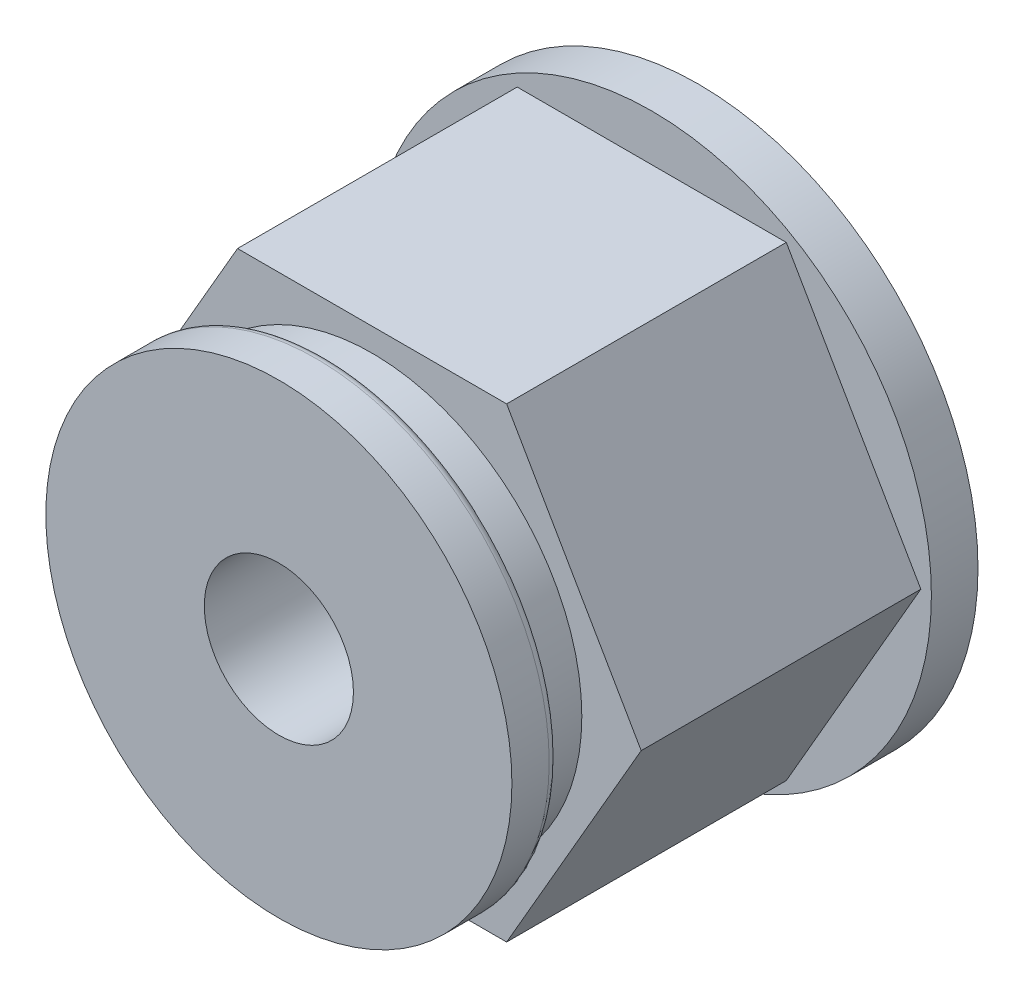
ISO-10303-21;
HEADER;
FILE_DESCRIPTION(('STEP AP214'),'2;1');
FILE_NAME('part.step','',(''),(''),'','','');
FILE_SCHEMA(('AUTOMOTIVE_DESIGN { 1 0 10303 214 1 1 1 1 }'));
ENDSEC;
DATA;
#1=APPLICATION_CONTEXT('core data for automotive mechanical design processes');
#2=APPLICATION_PROTOCOL_DEFINITION('international standard','automotive_design',2000,#1);
#3=PRODUCT_CONTEXT('',#1,'mechanical');
#4=PRODUCT('Part','Part','',(#3));
#5=PRODUCT_RELATED_PRODUCT_CATEGORY('part','',(#4));
#6=PRODUCT_DEFINITION_FORMATION('','',#4);
#7=PRODUCT_DEFINITION_CONTEXT('part definition',#1,'design');
#8=PRODUCT_DEFINITION('design','',#6,#7);
#9=PRODUCT_DEFINITION_SHAPE('','',#8);
#10=(LENGTH_UNIT() NAMED_UNIT(*) SI_UNIT(.MILLI.,.METRE.));
#11=(NAMED_UNIT(*) PLANE_ANGLE_UNIT() SI_UNIT($,.RADIAN.));
#12=(NAMED_UNIT(*) SI_UNIT($,.STERADIAN.) SOLID_ANGLE_UNIT());
#13=UNCERTAINTY_MEASURE_WITH_UNIT(LENGTH_MEASURE(1.E-05),#10,'distance_accuracy_value','');
#14=(GEOMETRIC_REPRESENTATION_CONTEXT(3) GLOBAL_UNCERTAINTY_ASSIGNED_CONTEXT((#13)) GLOBAL_UNIT_ASSIGNED_CONTEXT((#10,
#11,#12)) REPRESENTATION_CONTEXT('',''));
#15=CARTESIAN_POINT('',(0.,0.,0.));
#16=DIRECTION('',(0.,0.,1.));
#17=DIRECTION('',(1.,0.,0.));
#18=AXIS2_PLACEMENT_3D('',#15,#16,#17);
#19=CARTESIAN_POINT('',(0.,0.,1.27));
#20=DIRECTION('',(0.,0.,-1.));
#21=DIRECTION('',(-1.,0.,0.));
#22=AXIS2_PLACEMENT_3D('',#19,#20,#21);
#23=CYLINDRICAL_SURFACE('',#22,7.62);
#24=CARTESIAN_POINT('',(0.,0.,1.27));
#25=DIRECTION('',(0.,0.,1.));
#26=DIRECTION('',(1.,0.,0.));
#27=AXIS2_PLACEMENT_3D('',#24,#25,#26);
#28=CIRCLE('',#27,7.62);
#29=CARTESIAN_POINT('',(7.62,0.,1.27));
#30=VERTEX_POINT('',#29);
#31=EDGE_CURVE('E109',#30,#30,#28,.T.);
#32=ORIENTED_EDGE('',*,*,#31,.F.);
#33=EDGE_LOOP('',(#32));
#34=FACE_BOUND('',#33,.T.);
#35=CARTESIAN_POINT('',(0.,0.,0.));
#36=DIRECTION('',(0.,0.,1.));
#37=DIRECTION('',(1.,0.,0.));
#38=AXIS2_PLACEMENT_3D('',#35,#36,#37);
#39=CIRCLE('',#38,7.62);
#40=CARTESIAN_POINT('',(7.62,0.,0.));
#41=VERTEX_POINT('',#40);
#42=EDGE_CURVE('E106',#41,#41,#39,.T.);
#43=ORIENTED_EDGE('',*,*,#42,.T.);
#44=EDGE_LOOP('',(#43));
#45=FACE_BOUND('',#44,.T.);
#46=ADVANCED_FACE('F33',(#34,#45),#23,.T.);
#47=CARTESIAN_POINT('',(0.,0.,1.27));
#48=DIRECTION('',(0.,0.,1.));
#49=DIRECTION('',(1.,0.,0.));
#50=AXIS2_PLACEMENT_3D('',#47,#48,#49);
#51=PLANE('',#50);
#52=DIRECTION('',(-0.5,0.866025403784439,0.));
#53=VECTOR('',#52,1.);
#54=CARTESIAN_POINT('',(7.33234841870825,0.,1.27));
#55=LINE('',#54,#53);
#56=CARTESIAN_POINT('',(7.33234841870825,0.,1.27));
#57=VERTEX_POINT('',#56);
#58=CARTESIAN_POINT('',(3.66617420935413,6.35,1.27));
#59=VERTEX_POINT('',#58);
#60=EDGE_CURVE('E48',#57,#59,#55,.T.);
#61=ORIENTED_EDGE('',*,*,#60,.F.);
#62=DIRECTION('',(0.500000000000001,0.866025403784438,0.));
#63=VECTOR('',#62,1.);
#64=CARTESIAN_POINT('',(3.66617420935412,-6.35,1.27));
#65=LINE('',#64,#63);
#66=CARTESIAN_POINT('',(3.66617420935412,-6.35,1.27));
#67=VERTEX_POINT('',#66);
#68=EDGE_CURVE('E52',#67,#57,#65,.T.);
#69=ORIENTED_EDGE('',*,*,#68,.F.);
#70=DIRECTION('',(1.,0.,0.));
#71=VECTOR('',#70,1.);
#72=CARTESIAN_POINT('',(-3.66617420935412,-6.35,1.27));
#73=LINE('',#72,#71);
#74=CARTESIAN_POINT('',(-3.66617420935412,-6.35,1.27));
#75=VERTEX_POINT('',#74);
#76=EDGE_CURVE('E169',#75,#67,#73,.T.);
#77=ORIENTED_EDGE('',*,*,#76,.F.);
#78=DIRECTION('',(0.5,-0.866025403784439,0.));
#79=VECTOR('',#78,1.);
#80=CARTESIAN_POINT('',(-7.33234841870825,0.,1.27));
#81=LINE('',#80,#79);
#82=CARTESIAN_POINT('',(-7.33234841870825,0.,1.27));
#83=VERTEX_POINT('',#82);
#84=EDGE_CURVE('E166',#83,#75,#81,.T.);
#85=ORIENTED_EDGE('',*,*,#84,.F.);
#86=DIRECTION('',(-0.500000000000001,-0.866025403784438,0.));
#87=VECTOR('',#86,1.);
#88=CARTESIAN_POINT('',(-3.66617420935412,6.35,1.27));
#89=LINE('',#88,#87);
#90=CARTESIAN_POINT('',(-3.66617420935412,6.35,1.27));
#91=VERTEX_POINT('',#90);
#92=EDGE_CURVE('E163',#91,#83,#89,.T.);
#93=ORIENTED_EDGE('',*,*,#92,.F.);
#94=DIRECTION('',(-1.,0.,0.));
#95=VECTOR('',#94,1.);
#96=CARTESIAN_POINT('',(3.66617420935413,6.35,1.27));
#97=LINE('',#96,#95);
#98=EDGE_CURVE('E146',#59,#91,#97,.T.);
#99=ORIENTED_EDGE('',*,*,#98,.F.);
#100=EDGE_LOOP('',(#61,#69,#77,#85,#93,#99));
#101=FACE_BOUND('',#100,.T.);
#102=ORIENTED_EDGE('',*,*,#31,.T.);
#103=EDGE_LOOP('',(#102));
#104=FACE_BOUND('',#103,.T.);
#105=ADVANCED_FACE('F186',(#101,#104),#51,.T.);
#106=CARTESIAN_POINT('',(0.,0.,0.));
#107=DIRECTION('',(0.,0.,1.));
#108=DIRECTION('',(1.,0.,0.));
#109=AXIS2_PLACEMENT_3D('',#106,#107,#108);
#110=PLANE('',#109);
#111=CARTESIAN_POINT('',(0.,0.,0.));
#112=DIRECTION('',(0.,0.,1.));
#113=DIRECTION('',(1.,0.,0.));
#114=AXIS2_PLACEMENT_3D('',#111,#112,#113);
#115=CIRCLE('',#114,2.032);
#116=CARTESIAN_POINT('',(2.032,0.,0.));
#117=VERTEX_POINT('',#116);
#118=EDGE_CURVE('E144',#117,#117,#115,.F.);
#119=ORIENTED_EDGE('',*,*,#118,.F.);
#120=EDGE_LOOP('',(#119));
#121=FACE_BOUND('',#120,.T.);
#122=ORIENTED_EDGE('',*,*,#42,.F.);
#123=EDGE_LOOP('',(#122));
#124=FACE_BOUND('',#123,.T.);
#125=ADVANCED_FACE('F209',(#121,#124),#110,.F.);
#126=CARTESIAN_POINT('',(7.33234841870825,0.,8.89));
#127=DIRECTION('',(-0.866025403784439,-0.5,0.));
#128=DIRECTION('',(0.5,-0.866025403784439,0.));
#129=AXIS2_PLACEMENT_3D('',#126,#127,#128);
#130=PLANE('',#129);
#131=ORIENTED_EDGE('',*,*,#60,.T.);
#132=DIRECTION('',(0.,0.,-1.));
#133=VECTOR('',#132,1.);
#134=CARTESIAN_POINT('',(3.66617420935413,6.35,8.89));
#135=LINE('',#134,#133);
#136=CARTESIAN_POINT('',(3.66617420935413,6.35,8.89));
#137=VERTEX_POINT('',#136);
#138=EDGE_CURVE('E89',#137,#59,#135,.T.);
#139=ORIENTED_EDGE('',*,*,#138,.F.);
#140=DIRECTION('',(-0.5,0.866025403784439,0.));
#141=VECTOR('',#140,1.);
#142=CARTESIAN_POINT('',(7.33234841870825,0.,8.89));
#143=LINE('',#142,#141);
#144=CARTESIAN_POINT('',(7.33234841870825,0.,8.89));
#145=VERTEX_POINT('',#144);
#146=EDGE_CURVE('E95',#145,#137,#143,.T.);
#147=ORIENTED_EDGE('',*,*,#146,.F.);
#148=DIRECTION('',(0.,0.,-1.));
#149=VECTOR('',#148,1.);
#150=CARTESIAN_POINT('',(7.33234841870825,0.,8.89));
#151=LINE('',#150,#149);
#152=EDGE_CURVE('E160',#145,#57,#151,.T.);
#153=ORIENTED_EDGE('',*,*,#152,.T.);
#154=EDGE_LOOP('',(#131,#139,#147,#153));
#155=FACE_BOUND('',#154,.T.);
#156=ADVANCED_FACE('F105',(#155),#130,.F.);
#157=CARTESIAN_POINT('',(3.66617420935413,6.35,8.89));
#158=DIRECTION('',(0.,-1.,0.));
#159=DIRECTION('',(1.,0.,0.));
#160=AXIS2_PLACEMENT_3D('',#157,#158,#159);
#161=PLANE('',#160);
#162=ORIENTED_EDGE('',*,*,#98,.T.);
#163=DIRECTION('',(0.,0.,-1.));
#164=VECTOR('',#163,1.);
#165=CARTESIAN_POINT('',(-3.66617420935412,6.35,8.89));
#166=LINE('',#165,#164);
#167=CARTESIAN_POINT('',(-3.66617420935412,6.35,8.89));
#168=VERTEX_POINT('',#167);
#169=EDGE_CURVE('E91',#168,#91,#166,.T.);
#170=ORIENTED_EDGE('',*,*,#169,.F.);
#171=DIRECTION('',(-1.,0.,0.));
#172=VECTOR('',#171,1.);
#173=CARTESIAN_POINT('',(3.66617420935413,6.35,8.89));
#174=LINE('',#173,#172);
#175=EDGE_CURVE('E84',#137,#168,#174,.T.);
#176=ORIENTED_EDGE('',*,*,#175,.F.);
#177=ORIENTED_EDGE('',*,*,#138,.T.);
#178=EDGE_LOOP('',(#162,#170,#176,#177));
#179=FACE_BOUND('',#178,.T.);
#180=ADVANCED_FACE('F87',(#179),#161,.F.);
#181=CARTESIAN_POINT('',(-3.66617420935412,6.35,8.89));
#182=DIRECTION('',(0.866025403784438,-0.500000000000001,0.));
#183=DIRECTION('',(0.500000000000001,0.866025403784438,0.));
#184=AXIS2_PLACEMENT_3D('',#181,#182,#183);
#185=PLANE('',#184);
#186=ORIENTED_EDGE('',*,*,#92,.T.);
#187=DIRECTION('',(0.,0.,-1.));
#188=VECTOR('',#187,1.);
#189=CARTESIAN_POINT('',(-7.33234841870825,0.,8.89));
#190=LINE('',#189,#188);
#191=CARTESIAN_POINT('',(-7.33234841870825,0.,8.89));
#192=VERTEX_POINT('',#191);
#193=EDGE_CURVE('E111',#192,#83,#190,.T.);
#194=ORIENTED_EDGE('',*,*,#193,.F.);
#195=DIRECTION('',(-0.500000000000001,-0.866025403784438,0.));
#196=VECTOR('',#195,1.);
#197=CARTESIAN_POINT('',(-3.66617420935412,6.35,8.89));
#198=LINE('',#197,#196);
#199=EDGE_CURVE('E94',#168,#192,#198,.T.);
#200=ORIENTED_EDGE('',*,*,#199,.F.);
#201=ORIENTED_EDGE('',*,*,#169,.T.);
#202=EDGE_LOOP('',(#186,#194,#200,#201));
#203=FACE_BOUND('',#202,.T.);
#204=ADVANCED_FACE('F185',(#203),#185,.F.);
#205=CARTESIAN_POINT('',(-7.33234841870825,0.,8.89));
#206=DIRECTION('',(0.866025403784439,0.5,0.));
#207=DIRECTION('',(-0.5,0.866025403784439,0.));
#208=AXIS2_PLACEMENT_3D('',#205,#206,#207);
#209=PLANE('',#208);
#210=ORIENTED_EDGE('',*,*,#84,.T.);
#211=DIRECTION('',(0.,0.,-1.));
#212=VECTOR('',#211,1.);
#213=CARTESIAN_POINT('',(-3.66617420935412,-6.35,8.89));
#214=LINE('',#213,#212);
#215=CARTESIAN_POINT('',(-3.66617420935412,-6.35,8.89));
#216=VERTEX_POINT('',#215);
#217=EDGE_CURVE('E176',#216,#75,#214,.T.);
#218=ORIENTED_EDGE('',*,*,#217,.F.);
#219=DIRECTION('',(0.5,-0.866025403784439,0.));
#220=VECTOR('',#219,1.);
#221=CARTESIAN_POINT('',(-7.33234841870825,0.,8.89));
#222=LINE('',#221,#220);
#223=EDGE_CURVE('E156',#192,#216,#222,.T.);
#224=ORIENTED_EDGE('',*,*,#223,.F.);
#225=ORIENTED_EDGE('',*,*,#193,.T.);
#226=EDGE_LOOP('',(#210,#218,#224,#225));
#227=FACE_BOUND('',#226,.T.);
#228=ADVANCED_FACE('F182',(#227),#209,.F.);
#229=CARTESIAN_POINT('',(-3.66617420935412,-6.35,8.89));
#230=DIRECTION('',(0.,1.,0.));
#231=DIRECTION('',(-1.,0.,0.));
#232=AXIS2_PLACEMENT_3D('',#229,#230,#231);
#233=PLANE('',#232);
#234=ORIENTED_EDGE('',*,*,#76,.T.);
#235=DIRECTION('',(0.,0.,-1.));
#236=VECTOR('',#235,1.);
#237=CARTESIAN_POINT('',(3.66617420935412,-6.35,8.89));
#238=LINE('',#237,#236);
#239=CARTESIAN_POINT('',(3.66617420935412,-6.35,8.89));
#240=VERTEX_POINT('',#239);
#241=EDGE_CURVE('E173',#240,#67,#238,.T.);
#242=ORIENTED_EDGE('',*,*,#241,.F.);
#243=DIRECTION('',(1.,0.,0.));
#244=VECTOR('',#243,1.);
#245=CARTESIAN_POINT('',(-3.66617420935412,-6.35,8.89));
#246=LINE('',#245,#244);
#247=EDGE_CURVE('E158',#216,#240,#246,.T.);
#248=ORIENTED_EDGE('',*,*,#247,.F.);
#249=ORIENTED_EDGE('',*,*,#217,.T.);
#250=EDGE_LOOP('',(#234,#242,#248,#249));
#251=FACE_BOUND('',#250,.T.);
#252=ADVANCED_FACE('F190',(#251),#233,.F.);
#253=CARTESIAN_POINT('',(3.66617420935412,-6.35,8.89));
#254=DIRECTION('',(-0.866025403784438,0.500000000000001,0.));
#255=DIRECTION('',(-0.500000000000001,-0.866025403784438,0.));
#256=AXIS2_PLACEMENT_3D('',#253,#254,#255);
#257=PLANE('',#256);
#258=ORIENTED_EDGE('',*,*,#68,.T.);
#259=ORIENTED_EDGE('',*,*,#152,.F.);
#260=DIRECTION('',(0.500000000000001,0.866025403784438,0.));
#261=VECTOR('',#260,1.);
#262=CARTESIAN_POINT('',(3.66617420935412,-6.35,8.89));
#263=LINE('',#262,#261);
#264=EDGE_CURVE('E100',#240,#145,#263,.T.);
#265=ORIENTED_EDGE('',*,*,#264,.F.);
#266=ORIENTED_EDGE('',*,*,#241,.T.);
#267=EDGE_LOOP('',(#258,#259,#265,#266));
#268=FACE_BOUND('',#267,.T.);
#269=ADVANCED_FACE('F193',(#268),#257,.F.);
#270=CARTESIAN_POINT('',(0.,0.,8.89));
#271=DIRECTION('',(0.,0.,1.));
#272=DIRECTION('',(1.,0.,0.));
#273=AXIS2_PLACEMENT_3D('',#270,#271,#272);
#274=PLANE('',#273);
#275=CARTESIAN_POINT('',(0.,0.,8.89));
#276=DIRECTION('',(0.,0.,1.));
#277=DIRECTION('',(1.,0.,0.));
#278=AXIS2_PLACEMENT_3D('',#275,#276,#277);
#279=CIRCLE('',#278,5.715);
#280=CARTESIAN_POINT('',(5.715,0.,8.89));
#281=VERTEX_POINT('',#280);
#282=EDGE_CURVE('E116',#281,#281,#279,.T.);
#283=ORIENTED_EDGE('',*,*,#282,.F.);
#284=EDGE_LOOP('',(#283));
#285=FACE_BOUND('',#284,.T.);
#286=ORIENTED_EDGE('',*,*,#146,.T.);
#287=ORIENTED_EDGE('',*,*,#175,.T.);
#288=ORIENTED_EDGE('',*,*,#199,.T.);
#289=ORIENTED_EDGE('',*,*,#223,.T.);
#290=ORIENTED_EDGE('',*,*,#247,.T.);
#291=ORIENTED_EDGE('',*,*,#264,.T.);
#292=EDGE_LOOP('',(#286,#287,#288,#289,#290,#291));
#293=FACE_BOUND('',#292,.T.);
#294=ADVANCED_FACE('F98',(#285,#293),#274,.T.);
#295=CARTESIAN_POINT('',(0.,0.,10.16));
#296=DIRECTION('',(0.,0.,-1.));
#297=DIRECTION('',(-1.,0.,0.));
#298=AXIS2_PLACEMENT_3D('',#295,#296,#297);
#299=CYLINDRICAL_SURFACE('',#298,5.715);
#300=CARTESIAN_POINT('',(0.,0.,9.906));
#301=DIRECTION('',(0.,0.,1.));
#302=DIRECTION('',(1.,0.,0.));
#303=AXIS2_PLACEMENT_3D('',#300,#301,#302);
#304=CIRCLE('',#303,5.715);
#305=CARTESIAN_POINT('',(5.715,0.,9.906));
#306=VERTEX_POINT('',#305);
#307=EDGE_CURVE('E11',#306,#306,#304,.F.);
#308=ORIENTED_EDGE('',*,*,#307,.T.);
#309=EDGE_LOOP('',(#308));
#310=FACE_BOUND('',#309,.T.);
#311=ORIENTED_EDGE('',*,*,#282,.T.);
#312=EDGE_LOOP('',(#311));
#313=FACE_BOUND('',#312,.T.);
#314=ADVANCED_FACE('F138',(#310,#313),#299,.T.);
#315=CARTESIAN_POINT('',(0.,0.,11.43));
#316=DIRECTION('',(0.,0.,-1.));
#317=DIRECTION('',(-1.,0.,0.));
#318=AXIS2_PLACEMENT_3D('',#315,#316,#317);
#319=CYLINDRICAL_SURFACE('',#318,6.35);
#320=CARTESIAN_POINT('',(0.,0.,10.414));
#321=DIRECTION('',(0.,0.,1.));
#322=DIRECTION('',(1.,0.,0.));
#323=AXIS2_PLACEMENT_3D('',#320,#321,#322);
#324=CIRCLE('',#323,6.35);
#325=CARTESIAN_POINT('',(6.35,0.,10.414));
#326=VERTEX_POINT('',#325);
#327=EDGE_CURVE('E118',#326,#326,#324,.T.);
#328=ORIENTED_EDGE('',*,*,#327,.T.);
#329=EDGE_LOOP('',(#328));
#330=FACE_BOUND('',#329,.T.);
#331=CARTESIAN_POINT('',(0.,0.,11.43));
#332=DIRECTION('',(0.,0.,1.));
#333=DIRECTION('',(1.,0.,0.));
#334=AXIS2_PLACEMENT_3D('',#331,#332,#333);
#335=CIRCLE('',#334,6.35);
#336=CARTESIAN_POINT('',(6.35,0.,11.43));
#337=VERTEX_POINT('',#336);
#338=EDGE_CURVE('E142',#337,#337,#335,.T.);
#339=ORIENTED_EDGE('',*,*,#338,.F.);
#340=EDGE_LOOP('',(#339));
#341=FACE_BOUND('',#340,.T.);
#342=ADVANCED_FACE('F134',(#330,#341),#319,.T.);
#343=CARTESIAN_POINT('',(0.,0.,11.43));
#344=DIRECTION('',(0.,0.,1.));
#345=DIRECTION('',(1.,0.,0.));
#346=AXIS2_PLACEMENT_3D('',#343,#344,#345);
#347=PLANE('',#346);
#348=CARTESIAN_POINT('',(0.,0.,11.43));
#349=DIRECTION('',(0.,0.,1.));
#350=DIRECTION('',(1.,0.,0.));
#351=AXIS2_PLACEMENT_3D('',#348,#349,#350);
#352=CIRCLE('',#351,2.032);
#353=CARTESIAN_POINT('',(2.032,0.,11.43));
#354=VERTEX_POINT('',#353);
#355=EDGE_CURVE('E149',#354,#354,#352,.T.);
#356=ORIENTED_EDGE('',*,*,#355,.F.);
#357=EDGE_LOOP('',(#356));
#358=FACE_BOUND('',#357,.T.);
#359=ORIENTED_EDGE('',*,*,#338,.T.);
#360=EDGE_LOOP('',(#359));
#361=FACE_BOUND('',#360,.T.);
#362=ADVANCED_FACE('F137',(#358,#361),#347,.T.);
#363=CARTESIAN_POINT('',(0.,0.,10.16));
#364=DIRECTION('',(0.,0.,1.));
#365=DIRECTION('',(1.,0.,0.));
#366=AXIS2_PLACEMENT_3D('',#363,#364,#365);
#367=PLANE('',#366);
#368=CARTESIAN_POINT('',(0.,0.,10.16));
#369=DIRECTION('',(0.,0.,1.));
#370=DIRECTION('',(1.,0.,0.));
#371=AXIS2_PLACEMENT_3D('',#368,#369,#370);
#372=CIRCLE('',#371,6.096);
#373=CARTESIAN_POINT('',(6.096,0.,10.16));
#374=VERTEX_POINT('',#373);
#375=EDGE_CURVE('E41',#374,#374,#372,.F.);
#376=ORIENTED_EDGE('',*,*,#375,.T.);
#377=EDGE_LOOP('',(#376));
#378=FACE_BOUND('',#377,.T.);
#379=CARTESIAN_POINT('',(0.,0.,10.16));
#380=DIRECTION('',(0.,0.,1.));
#381=DIRECTION('',(1.,0.,0.));
#382=AXIS2_PLACEMENT_3D('',#379,#380,#381);
#383=CIRCLE('',#382,5.969);
#384=CARTESIAN_POINT('',(5.969,0.,10.16));
#385=VERTEX_POINT('',#384);
#386=EDGE_CURVE('E121',#385,#385,#383,.T.);
#387=ORIENTED_EDGE('',*,*,#386,.T.);
#388=EDGE_LOOP('',(#387));
#389=FACE_BOUND('',#388,.T.);
#390=ADVANCED_FACE('F126',(#378,#389),#367,.F.);
#391=CARTESIAN_POINT('',(0.,0.,10.414));
#392=DIRECTION('',(0.,0.,1.));
#393=DIRECTION('',(1.,0.,0.));
#394=AXIS2_PLACEMENT_3D('',#391,#392,#393);
#395=TOROIDAL_SURFACE('',#394,6.096,0.254);
#396=ORIENTED_EDGE('',*,*,#375,.F.);
#397=EDGE_LOOP('',(#396));
#398=FACE_BOUND('',#397,.T.);
#399=ORIENTED_EDGE('',*,*,#327,.F.);
#400=EDGE_LOOP('',(#399));
#401=FACE_BOUND('',#400,.T.);
#402=ADVANCED_FACE('F129',(#398,#401),#395,.T.);
#403=CARTESIAN_POINT('',(0.,0.,9.906));
#404=DIRECTION('',(0.,0.,1.));
#405=DIRECTION('',(1.,0.,0.));
#406=AXIS2_PLACEMENT_3D('',#403,#404,#405);
#407=TOROIDAL_SURFACE('',#406,5.969,0.254);
#408=ORIENTED_EDGE('',*,*,#307,.F.);
#409=EDGE_LOOP('',(#408));
#410=FACE_BOUND('',#409,.T.);
#411=ORIENTED_EDGE('',*,*,#386,.F.);
#412=EDGE_LOOP('',(#411));
#413=FACE_BOUND('',#412,.T.);
#414=ADVANCED_FACE('F35',(#410,#413),#407,.F.);
#415=CARTESIAN_POINT('',(0.,0.,-5.74736391748426));
#416=DIRECTION('',(0.,0.,1.));
#417=DIRECTION('',(1.,0.,0.));
#418=AXIS2_PLACEMENT_3D('',#415,#416,#417);
#419=CYLINDRICAL_SURFACE('',#418,2.032);
#420=ORIENTED_EDGE('',*,*,#118,.T.);
#421=EDGE_LOOP('',(#420));
#422=FACE_BOUND('',#421,.T.);
#423=ORIENTED_EDGE('',*,*,#355,.T.);
#424=EDGE_LOOP('',(#423));
#425=FACE_BOUND('',#424,.T.);
#426=ADVANCED_FACE('F282',(#422,#425),#419,.F.);
#427=CLOSED_SHELL('',(#46,#105,#125,#156,#180,#204,#228,#252,#269,#294,#314,#342,#362,#390,#402,
#414,#426));
#428=MANIFOLD_SOLID_BREP('B2',#427);
#429=ADVANCED_BREP_SHAPE_REPRESENTATION('',(#18,#428),#14);
#430=SHAPE_DEFINITION_REPRESENTATION(#9,#429);
ENDSEC;
END-ISO-10303-21;
